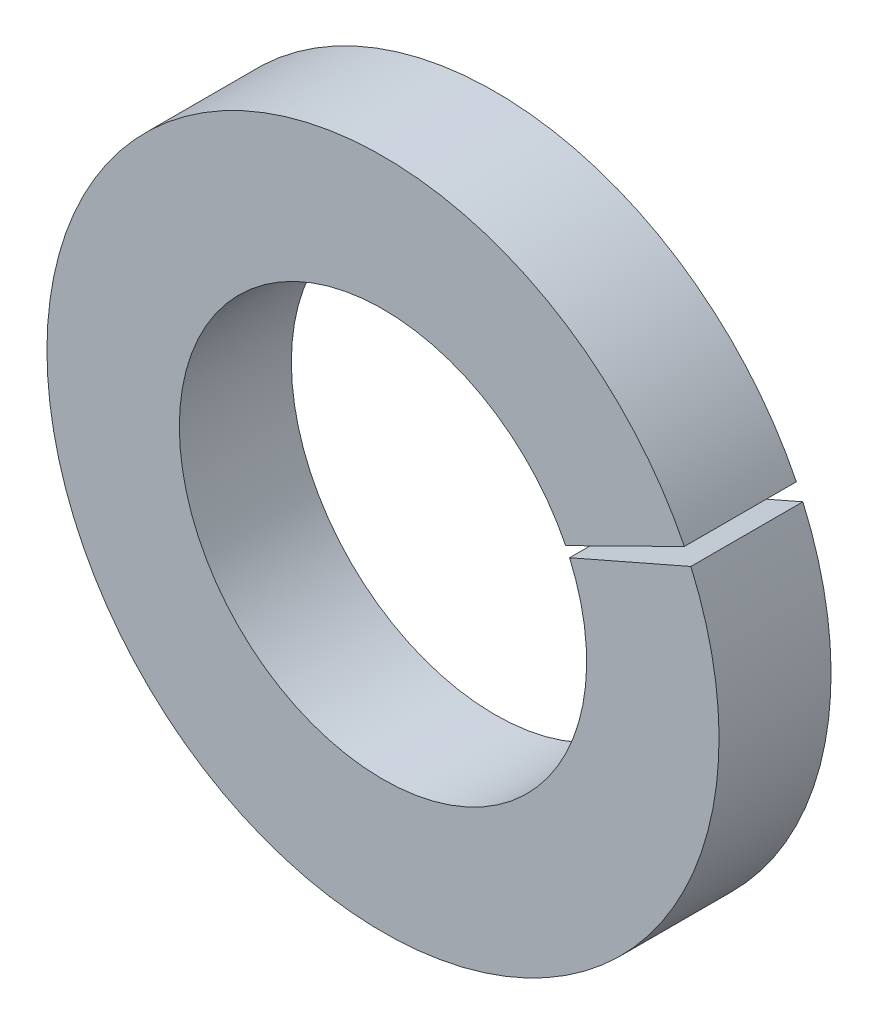
ISO-10303-21;
HEADER;
FILE_DESCRIPTION(('STEP AP214'),'2;1');
FILE_NAME('part.step','',(''),(''),'','','');
FILE_SCHEMA(('AUTOMOTIVE_DESIGN { 1 0 10303 214 1 1 1 1 }'));
ENDSEC;
DATA;
#1=APPLICATION_CONTEXT('core data for automotive mechanical design processes');
#2=APPLICATION_PROTOCOL_DEFINITION('international standard','automotive_design',2000,#1);
#3=PRODUCT_CONTEXT('',#1,'mechanical');
#4=PRODUCT('Part','Part','',(#3));
#5=PRODUCT_RELATED_PRODUCT_CATEGORY('part','',(#4));
#6=PRODUCT_DEFINITION_FORMATION('','',#4);
#7=PRODUCT_DEFINITION_CONTEXT('part definition',#1,'design');
#8=PRODUCT_DEFINITION('design','',#6,#7);
#9=PRODUCT_DEFINITION_SHAPE('','',#8);
#10=(LENGTH_UNIT() NAMED_UNIT(*) SI_UNIT(.MILLI.,.METRE.));
#11=(NAMED_UNIT(*) PLANE_ANGLE_UNIT() SI_UNIT($,.RADIAN.));
#12=(NAMED_UNIT(*) SI_UNIT($,.STERADIAN.) SOLID_ANGLE_UNIT());
#13=UNCERTAINTY_MEASURE_WITH_UNIT(LENGTH_MEASURE(1.E-05),#10,'distance_accuracy_value','');
#14=(GEOMETRIC_REPRESENTATION_CONTEXT(3) GLOBAL_UNCERTAINTY_ASSIGNED_CONTEXT((#13)) GLOBAL_UNIT_ASSIGNED_CONTEXT((#10,
#11,#12)) REPRESENTATION_CONTEXT('',''));
#15=CARTESIAN_POINT('',(0.,0.,0.));
#16=DIRECTION('',(0.,0.,1.));
#17=DIRECTION('',(1.,0.,0.));
#18=AXIS2_PLACEMENT_3D('',#15,#16,#17);
#19=CARTESIAN_POINT('',(0.,0.,0.55));
#20=DIRECTION('',(0.,0.,1.));
#21=DIRECTION('',(1.,0.,0.));
#22=AXIS2_PLACEMENT_3D('',#19,#20,#21);
#23=PLANE('',#22);
#24=DIRECTION('',(0.91612800253932,0.400885872741003,0.));
#25=VECTOR('',#24,1.);
#26=CARTESIAN_POINT('',(4.81245926481222,2.10587049741662,0.55));
#27=LINE('',#26,#25);
#28=CARTESIAN_POINT('',(0.91612800253932,0.400885872741003,0.55));
#29=VERTEX_POINT('',#28);
#30=CARTESIAN_POINT('',(1.51161120418988,0.661461690022655,0.55));
#31=VERTEX_POINT('',#30);
#32=EDGE_CURVE('E81',#29,#31,#27,.T.);
#33=ORIENTED_EDGE('',*,*,#32,.F.);
#34=CARTESIAN_POINT('',(0.,0.,0.55));
#35=DIRECTION('',(0.,0.,1.));
#36=DIRECTION('',(1.,0.,0.));
#37=AXIS2_PLACEMENT_3D('',#34,#35,#36);
#38=CIRCLE('',#37,1.);
#39=CARTESIAN_POINT('',(0.896700463174137,0.442637864787105,0.55));
#40=VERTEX_POINT('',#39);
#41=EDGE_CURVE('E90',#40,#29,#38,.T.);
#42=ORIENTED_EDGE('',*,*,#41,.F.);
#43=DIRECTION('',(-0.896700463174137,-0.442637864787105,0.));
#44=VECTOR('',#43,1.);
#45=CARTESIAN_POINT('',(0.,0.,0.55));
#46=LINE('',#45,#44);
#47=CARTESIAN_POINT('',(1.47955576423733,0.730352476898723,0.55));
#48=VERTEX_POINT('',#47);
#49=EDGE_CURVE('E64',#48,#40,#46,.T.);
#50=ORIENTED_EDGE('',*,*,#49,.F.);
#51=CARTESIAN_POINT('',(0.,0.,0.55));
#52=DIRECTION('',(0.,0.,1.));
#53=DIRECTION('',(1.,0.,0.));
#54=AXIS2_PLACEMENT_3D('',#51,#52,#53);
#55=CIRCLE('',#54,1.65);
#56=EDGE_CURVE('E92',#48,#31,#55,.T.);
#57=ORIENTED_EDGE('',*,*,#56,.T.);
#58=EDGE_LOOP('',(#33,#42,#50,#57));
#59=FACE_BOUND('',#58,.T.);
#60=ADVANCED_FACE('F41',(#59),#23,.T.);
#61=CARTESIAN_POINT('',(0.,0.,0.));
#62=DIRECTION('',(0.,0.,1.));
#63=DIRECTION('',(1.,0.,0.));
#64=AXIS2_PLACEMENT_3D('',#61,#62,#63);
#65=PLANE('',#64);
#66=CARTESIAN_POINT('',(0.,0.,0.));
#67=DIRECTION('',(0.,0.,1.));
#68=DIRECTION('',(1.,0.,0.));
#69=AXIS2_PLACEMENT_3D('',#66,#67,#68);
#70=CIRCLE('',#69,1.);
#71=CARTESIAN_POINT('',(0.896700463174138,0.442637864787105,0.));
#72=VERTEX_POINT('',#71);
#73=CARTESIAN_POINT('',(0.91612800253932,0.400885872741003,0.));
#74=VERTEX_POINT('',#73);
#75=EDGE_CURVE('E98',#72,#74,#70,.T.);
#76=ORIENTED_EDGE('',*,*,#75,.T.);
#77=DIRECTION('',(0.91612800253932,0.400885872741003,0.));
#78=VECTOR('',#77,1.);
#79=CARTESIAN_POINT('',(0.,0.,0.));
#80=LINE('',#79,#78);
#81=CARTESIAN_POINT('',(1.51161120418988,0.661461690022654,0.));
#82=VERTEX_POINT('',#81);
#83=EDGE_CURVE('E56',#74,#82,#80,.T.);
#84=ORIENTED_EDGE('',*,*,#83,.T.);
#85=CARTESIAN_POINT('',(0.,0.,0.));
#86=DIRECTION('',(0.,0.,1.));
#87=DIRECTION('',(1.,0.,0.));
#88=AXIS2_PLACEMENT_3D('',#85,#86,#87);
#89=CIRCLE('',#88,1.65);
#90=CARTESIAN_POINT('',(1.47955576423733,0.730352476898723,0.));
#91=VERTEX_POINT('',#90);
#92=EDGE_CURVE('E97',#91,#82,#89,.T.);
#93=ORIENTED_EDGE('',*,*,#92,.F.);
#94=DIRECTION('',(-0.896700463174138,-0.442637864787105,0.));
#95=VECTOR('',#94,1.);
#96=CARTESIAN_POINT('',(0.,0.,0.));
#97=LINE('',#96,#95);
#98=EDGE_CURVE('E113',#91,#72,#97,.T.);
#99=ORIENTED_EDGE('',*,*,#98,.T.);
#100=EDGE_LOOP('',(#76,#84,#93,#99));
#101=FACE_BOUND('',#100,.T.);
#102=ADVANCED_FACE('F117',(#101),#65,.F.);
#103=CARTESIAN_POINT('',(0.,0.,0.55));
#104=DIRECTION('',(0.,0.,-1.));
#105=DIRECTION('',(-1.,0.,0.));
#106=AXIS2_PLACEMENT_3D('',#103,#104,#105);
#107=CYLINDRICAL_SURFACE('',#106,1.65);
#108=ORIENTED_EDGE('',*,*,#92,.T.);
#109=DIRECTION('',(0.,0.,-1.));
#110=VECTOR('',#109,1.);
#111=CARTESIAN_POINT('',(1.51161120418988,0.661461690022655,0.55));
#112=LINE('',#111,#110);
#113=EDGE_CURVE('E104',#82,#31,#112,.F.);
#114=ORIENTED_EDGE('',*,*,#113,.T.);
#115=ORIENTED_EDGE('',*,*,#56,.F.);
#116=DIRECTION('',(0.,0.,-1.));
#117=VECTOR('',#116,1.);
#118=CARTESIAN_POINT('',(1.47955576423733,0.730352476898723,0.55));
#119=LINE('',#118,#117);
#120=EDGE_CURVE('E119',#48,#91,#119,.T.);
#121=ORIENTED_EDGE('',*,*,#120,.T.);
#122=EDGE_LOOP('',(#108,#114,#115,#121));
#123=FACE_BOUND('',#122,.T.);
#124=ADVANCED_FACE('F43',(#123),#107,.T.);
#125=CARTESIAN_POINT('',(0.,0.,0.55));
#126=DIRECTION('',(0.,0.,-1.));
#127=DIRECTION('',(-1.,0.,0.));
#128=AXIS2_PLACEMENT_3D('',#125,#126,#127);
#129=CYLINDRICAL_SURFACE('',#128,1.);
#130=DIRECTION('',(0.,0.,-1.));
#131=VECTOR('',#130,1.);
#132=CARTESIAN_POINT('',(0.91612800253932,0.400885872741003,0.55));
#133=LINE('',#132,#131);
#134=EDGE_CURVE('E11',#74,#29,#133,.F.);
#135=ORIENTED_EDGE('',*,*,#134,.F.);
#136=ORIENTED_EDGE('',*,*,#75,.F.);
#137=DIRECTION('',(0.,0.,-1.));
#138=VECTOR('',#137,1.);
#139=CARTESIAN_POINT('',(0.896700463174138,0.442637864787105,0.55));
#140=LINE('',#139,#138);
#141=EDGE_CURVE('E50',#40,#72,#140,.T.);
#142=ORIENTED_EDGE('',*,*,#141,.F.);
#143=ORIENTED_EDGE('',*,*,#41,.T.);
#144=EDGE_LOOP('',(#135,#136,#142,#143));
#145=FACE_BOUND('',#144,.T.);
#146=ADVANCED_FACE('F95',(#145),#129,.F.);
#147=CARTESIAN_POINT('',(0.,0.,-9.45));
#148=DIRECTION('',(-0.442637864787105,0.896700463174138,0.));
#149=DIRECTION('',(-0.896700463174138,-0.442637864787105,0.));
#150=AXIS2_PLACEMENT_3D('',#147,#148,#149);
#151=PLANE('',#150);
#152=ORIENTED_EDGE('',*,*,#49,.T.);
#153=ORIENTED_EDGE('',*,*,#141,.T.);
#154=ORIENTED_EDGE('',*,*,#98,.F.);
#155=ORIENTED_EDGE('',*,*,#120,.F.);
#156=EDGE_LOOP('',(#152,#153,#154,#155));
#157=FACE_BOUND('',#156,.T.);
#158=ADVANCED_FACE('F112',(#157),#151,.F.);
#159=CARTESIAN_POINT('',(4.81245926481222,2.10587049741662,-9.45));
#160=DIRECTION('',(0.400885872741003,-0.91612800253932,0.));
#161=DIRECTION('',(0.91612800253932,0.400885872741003,0.));
#162=AXIS2_PLACEMENT_3D('',#159,#160,#161);
#163=PLANE('',#162);
#164=ORIENTED_EDGE('',*,*,#83,.F.);
#165=ORIENTED_EDGE('',*,*,#134,.T.);
#166=ORIENTED_EDGE('',*,*,#32,.T.);
#167=ORIENTED_EDGE('',*,*,#113,.F.);
#168=EDGE_LOOP('',(#164,#165,#166,#167));
#169=FACE_BOUND('',#168,.T.);
#170=ADVANCED_FACE('F80',(#169),#163,.F.);
#171=CLOSED_SHELL('',(#60,#102,#124,#146,#158,#170));
#172=MANIFOLD_SOLID_BREP('B2',#171);
#173=ADVANCED_BREP_SHAPE_REPRESENTATION('',(#18,#172),#14);
#174=SHAPE_DEFINITION_REPRESENTATION(#9,#173);
ENDSEC;
END-ISO-10303-21;
